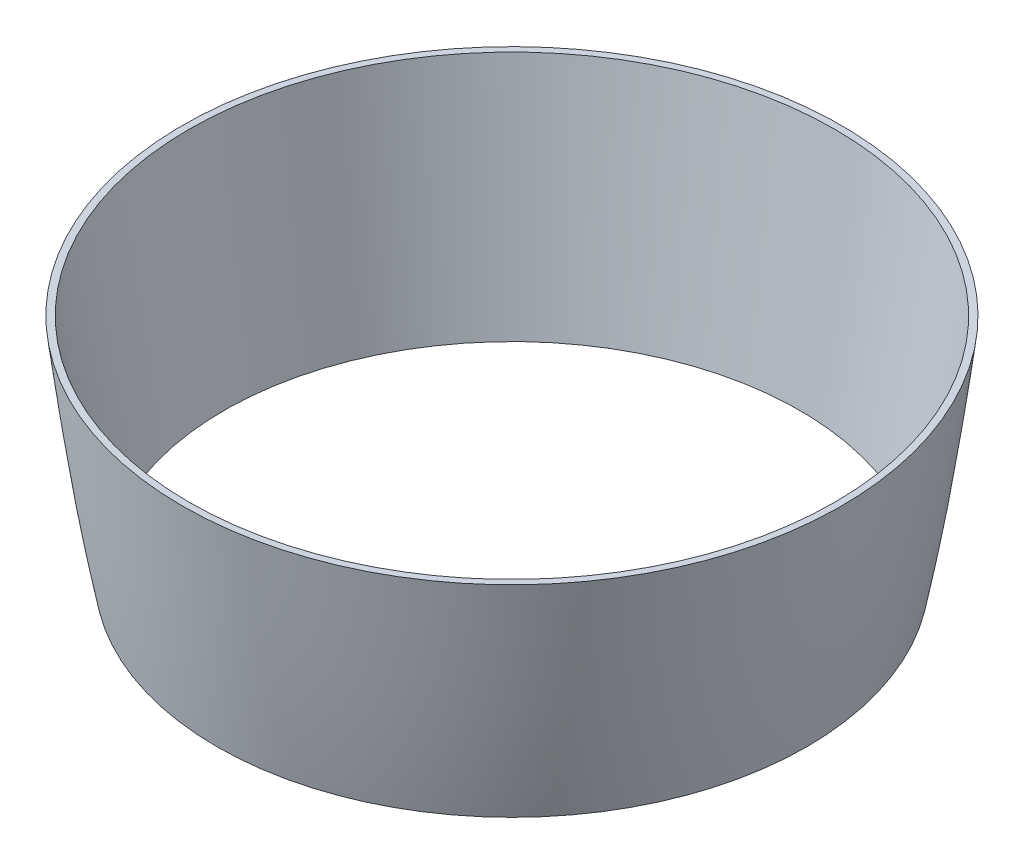
ISO-10303-21;
HEADER;
FILE_DESCRIPTION(('STEP AP214'),'2;1');
FILE_NAME('part.step','',(''),(''),'','','');
FILE_SCHEMA(('AUTOMOTIVE_DESIGN { 1 0 10303 214 1 1 1 1 }'));
ENDSEC;
DATA;
#1=APPLICATION_CONTEXT('core data for automotive mechanical design processes');
#2=APPLICATION_PROTOCOL_DEFINITION('international standard','automotive_design',2000,#1);
#3=PRODUCT_CONTEXT('',#1,'mechanical');
#4=PRODUCT('Part','Part','',(#3));
#5=PRODUCT_RELATED_PRODUCT_CATEGORY('part','',(#4));
#6=PRODUCT_DEFINITION_FORMATION('','',#4);
#7=PRODUCT_DEFINITION_CONTEXT('part definition',#1,'design');
#8=PRODUCT_DEFINITION('design','',#6,#7);
#9=PRODUCT_DEFINITION_SHAPE('','',#8);
#10=(LENGTH_UNIT() NAMED_UNIT(*) SI_UNIT(.MILLI.,.METRE.));
#11=(NAMED_UNIT(*) PLANE_ANGLE_UNIT() SI_UNIT($,.RADIAN.));
#12=(NAMED_UNIT(*) SI_UNIT($,.STERADIAN.) SOLID_ANGLE_UNIT());
#13=UNCERTAINTY_MEASURE_WITH_UNIT(LENGTH_MEASURE(1.E-05),#10,'distance_accuracy_value','');
#14=(GEOMETRIC_REPRESENTATION_CONTEXT(3) GLOBAL_UNCERTAINTY_ASSIGNED_CONTEXT((#13)) GLOBAL_UNIT_ASSIGNED_CONTEXT((#10,
#11,#12)) REPRESENTATION_CONTEXT('',''));
#15=CARTESIAN_POINT('',(0.,0.,0.));
#16=DIRECTION('',(0.,0.,1.));
#17=DIRECTION('',(1.,0.,0.));
#18=AXIS2_PLACEMENT_3D('',#15,#16,#17);
#19=CARTESIAN_POINT('',(0.,1109.76660156006,0.));
#20=DIRECTION('',(0.,1.,0.));
#21=DIRECTION('',(0.,0.,1.));
#22=AXIS2_PLACEMENT_3D('',#19,#20,#21);
#23=CONICAL_SURFACE('',#22,153.937454222864,0.154145906691);
#24=CARTESIAN_POINT('',(0.,1109.76660156006,0.));
#25=DIRECTION('',(0.,1.,0.));
#26=DIRECTION('',(0.,0.,1.));
#27=AXIS2_PLACEMENT_3D('',#24,#25,#26);
#28=CIRCLE('',#27,153.937454222864);
#29=CARTESIAN_POINT('',(0.,1109.76660156006,153.937454222864));
#30=VERTEX_POINT('',#29);
#31=EDGE_CURVE('E16',#30,#30,#28,.T.);
#32=ORIENTED_EDGE('',*,*,#31,.T.);
#33=EDGE_LOOP('',(#32));
#34=FACE_BOUND('',#33,.T.);
#35=CARTESIAN_POINT('',(0.,1002.07208252009,0.));
#36=DIRECTION('',(0.,1.,0.));
#37=DIRECTION('',(0.,0.,1.));
#38=AXIS2_PLACEMENT_3D('',#35,#36,#37);
#39=CIRCLE('',#38,137.204040527014);
#40=CARTESIAN_POINT('',(0.,1002.07208252009,137.204040527014));
#41=VERTEX_POINT('',#40);
#42=EDGE_CURVE('E25',#41,#41,#39,.T.);
#43=ORIENTED_EDGE('',*,*,#42,.F.);
#44=EDGE_LOOP('',(#43));
#45=FACE_BOUND('',#44,.T.);
#46=ADVANCED_FACE('F13',(#34,#45),#23,.F.);
#47=CARTESIAN_POINT('',(0.,1109.76660156,157.09413147));
#48=DIRECTION('',(0.,-1.,0.));
#49=DIRECTION('',(0.,0.,-1.));
#50=AXIS2_PLACEMENT_3D('',#47,#48,#49);
#51=PLANE('',#50);
#52=ORIENTED_EDGE('',*,*,#31,.F.);
#53=EDGE_LOOP('',(#52));
#54=FACE_BOUND('',#53,.T.);
#55=CARTESIAN_POINT('',(0.,1109.76660156,0.));
#56=DIRECTION('',(0.,1.,0.));
#57=DIRECTION('',(0.,0.,1.));
#58=AXIS2_PLACEMENT_3D('',#55,#56,#57);
#59=CIRCLE('',#58,157.09413147);
#60=CARTESIAN_POINT('',(0.,1109.76660156,157.09413147));
#61=VERTEX_POINT('',#60);
#62=EDGE_CURVE('E20',#61,#61,#59,.T.);
#63=ORIENTED_EDGE('',*,*,#62,.T.);
#64=EDGE_LOOP('',(#63));
#65=FACE_BOUND('',#64,.T.);
#66=ADVANCED_FACE('F39',(#54,#65),#51,.F.);
#67=CARTESIAN_POINT('',(0.,1002.07208252,137.204040527));
#68=DIRECTION('',(0.,-1.,0.));
#69=DIRECTION('',(0.,0.,-1.));
#70=AXIS2_PLACEMENT_3D('',#67,#68,#69);
#71=PLANE('',#70);
#72=ORIENTED_EDGE('',*,*,#42,.T.);
#73=EDGE_LOOP('',(#72));
#74=FACE_BOUND('',#73,.T.);
#75=CARTESIAN_POINT('',(0.,1002.07208252,0.));
#76=DIRECTION('',(0.,1.,0.));
#77=DIRECTION('',(0.,0.,1.));
#78=AXIS2_PLACEMENT_3D('',#75,#76,#77);
#79=CIRCLE('',#78,140.55645752);
#80=CARTESIAN_POINT('',(0.,1002.07208252,140.55645752));
#81=VERTEX_POINT('',#80);
#82=EDGE_CURVE('E9',#81,#81,#79,.F.);
#83=ORIENTED_EDGE('',*,*,#82,.T.);
#84=EDGE_LOOP('',(#83));
#85=FACE_BOUND('',#84,.T.);
#86=ADVANCED_FACE('F42',(#74,#85),#71,.T.);
#87=CARTESIAN_POINT('',(0.,1002.07208252,140.55645752));
#88=CARTESIAN_POINT('',(0.,1009.58317804,142.047836518));
#89=CARTESIAN_POINT('',(0.,1017.10609896,143.468514223));
#90=CARTESIAN_POINT('',(0.,1024.64084529,144.818490632));
#91=CARTESIAN_POINT('',(0.,1041.29370667,147.641440166));
#92=CARTESIAN_POINT('',(0.,1057.99659626,150.159920158));
#93=CARTESIAN_POINT('',(0.,1067.14247647,151.460420751));
#94=CARTESIAN_POINT('',(0.,1081.15358542,153.382509572));
#95=CARTESIAN_POINT('',(0.,1095.17437901,155.22492419));
#96=CARTESIAN_POINT('',(0.,1100.03760063,155.855930661));
#97=CARTESIAN_POINT('',(0.,1104.90167481,156.478999754));
#98=CARTESIAN_POINT('',(0.,1109.76660156,157.09413147));
#99=(BOUNDED_CURVE() B_SPLINE_CURVE(5,(#87,#88,#89,#90,#91,#92,#93,#94,#95,#96,#97,#98),
.UNSPECIFIED.,.F.,.F.) B_SPLINE_CURVE_WITH_KNOTS((6,3,3,6),(0.,38.27354816,84.4574350172,
108.977274768),
.UNSPECIFIED.) CURVE() GEOMETRIC_REPRESENTATION_ITEM() RATIONAL_B_SPLINE_CURVE((1.,1.,1.,1.,1.,
1.,1.,1.,1.,1.,1.,1.)) REPRESENTATION_ITEM(''));
#100=CARTESIAN_POINT('',(0.,1055.91934204,0.));
#101=DIRECTION('',(0.,1.,0.));
#102=AXIS1_PLACEMENT('',#100,#101);
#103=SURFACE_OF_REVOLUTION('',#99,#102);
#104=ORIENTED_EDGE('',*,*,#82,.F.);
#105=EDGE_LOOP('',(#104));
#106=FACE_BOUND('',#105,.T.);
#107=ORIENTED_EDGE('',*,*,#62,.F.);
#108=EDGE_LOOP('',(#107));
#109=FACE_BOUND('',#108,.T.);
#110=ADVANCED_FACE('F45',(#106,#109),#103,.T.);
#111=CLOSED_SHELL('',(#46,#66,#86,#110));
#112=MANIFOLD_SOLID_BREP('B1',#111);
#113=ADVANCED_BREP_SHAPE_REPRESENTATION('',(#18,#112),#14);
#114=SHAPE_DEFINITION_REPRESENTATION(#9,#113);
ENDSEC;
END-ISO-10303-21;
